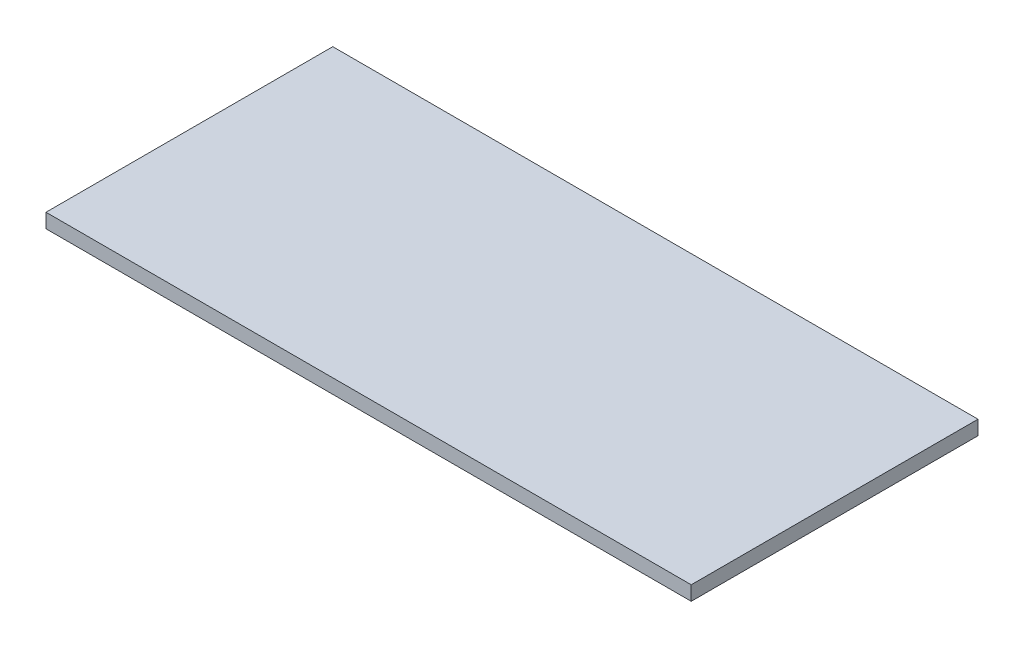
ISO-10303-21;
HEADER;
FILE_DESCRIPTION(('STEP AP214'),'2;1');
FILE_NAME('part.step','',(''),(''),'','','');
FILE_SCHEMA(('AUTOMOTIVE_DESIGN { 1 0 10303 214 1 1 1 1 }'));
ENDSEC;
DATA;
#1=APPLICATION_CONTEXT('core data for automotive mechanical design processes');
#2=APPLICATION_PROTOCOL_DEFINITION('international standard','automotive_design',2000,#1);
#3=PRODUCT_CONTEXT('',#1,'mechanical');
#4=PRODUCT('Part','Part','',(#3));
#5=PRODUCT_RELATED_PRODUCT_CATEGORY('part','',(#4));
#6=PRODUCT_DEFINITION_FORMATION('','',#4);
#7=PRODUCT_DEFINITION_CONTEXT('part definition',#1,'design');
#8=PRODUCT_DEFINITION('design','',#6,#7);
#9=PRODUCT_DEFINITION_SHAPE('','',#8);
#10=(LENGTH_UNIT() NAMED_UNIT(*) SI_UNIT(.MILLI.,.METRE.));
#11=(NAMED_UNIT(*) PLANE_ANGLE_UNIT() SI_UNIT($,.RADIAN.));
#12=(NAMED_UNIT(*) SI_UNIT($,.STERADIAN.) SOLID_ANGLE_UNIT());
#13=UNCERTAINTY_MEASURE_WITH_UNIT(LENGTH_MEASURE(1.E-05),#10,'distance_accuracy_value','');
#14=(GEOMETRIC_REPRESENTATION_CONTEXT(3) GLOBAL_UNCERTAINTY_ASSIGNED_CONTEXT((#13)) GLOBAL_UNIT_ASSIGNED_CONTEXT((#10,
#11,#12)) REPRESENTATION_CONTEXT('',''));
#15=CARTESIAN_POINT('',(0.,0.,0.));
#16=DIRECTION('',(0.,0.,1.));
#17=DIRECTION('',(1.,0.,0.));
#18=AXIS2_PLACEMENT_3D('',#15,#16,#17);
#19=CARTESIAN_POINT('',(450.,20.,-200.));
#20=DIRECTION('',(-1.,0.,0.));
#21=DIRECTION('',(0.,0.,1.));
#22=AXIS2_PLACEMENT_3D('',#19,#20,#21);
#23=PLANE('',#22);
#24=DIRECTION('',(0.,0.,-1.));
#25=VECTOR('',#24,1.);
#26=CARTESIAN_POINT('',(450.,0.,-200.));
#27=LINE('',#26,#25);
#28=CARTESIAN_POINT('',(450.,0.,200.));
#29=VERTEX_POINT('',#28);
#30=CARTESIAN_POINT('',(450.,0.,-200.));
#31=VERTEX_POINT('',#30);
#32=EDGE_CURVE('E96',#29,#31,#27,.T.);
#33=ORIENTED_EDGE('',*,*,#32,.T.);
#34=DIRECTION('',(0.,-1.,0.));
#35=VECTOR('',#34,1.);
#36=CARTESIAN_POINT('',(450.,20.,-200.));
#37=LINE('',#36,#35);
#38=CARTESIAN_POINT('',(450.,20.,-200.));
#39=VERTEX_POINT('',#38);
#40=EDGE_CURVE('E11',#39,#31,#37,.T.);
#41=ORIENTED_EDGE('',*,*,#40,.F.);
#42=DIRECTION('',(0.,0.,-1.));
#43=VECTOR('',#42,1.);
#44=CARTESIAN_POINT('',(450.,20.,-200.));
#45=LINE('',#44,#43);
#46=CARTESIAN_POINT('',(450.,20.,200.));
#47=VERTEX_POINT('',#46);
#48=EDGE_CURVE('E84',#47,#39,#45,.T.);
#49=ORIENTED_EDGE('',*,*,#48,.F.);
#50=DIRECTION('',(0.,-1.,0.));
#51=VECTOR('',#50,1.);
#52=CARTESIAN_POINT('',(450.,20.,200.));
#53=LINE('',#52,#51);
#54=EDGE_CURVE('E92',#47,#29,#53,.T.);
#55=ORIENTED_EDGE('',*,*,#54,.T.);
#56=EDGE_LOOP('',(#33,#41,#49,#55));
#57=FACE_BOUND('',#56,.T.);
#58=ADVANCED_FACE('F33',(#57),#23,.F.);
#59=CARTESIAN_POINT('',(-450.,20.,-200.));
#60=DIRECTION('',(0.,0.,1.));
#61=DIRECTION('',(1.,0.,0.));
#62=AXIS2_PLACEMENT_3D('',#59,#60,#61);
#63=PLANE('',#62);
#64=DIRECTION('',(-1.,0.,0.));
#65=VECTOR('',#64,1.);
#66=CARTESIAN_POINT('',(-450.,0.,-200.));
#67=LINE('',#66,#65);
#68=CARTESIAN_POINT('',(-450.,0.,-200.));
#69=VERTEX_POINT('',#68);
#70=EDGE_CURVE('E88',#31,#69,#67,.T.);
#71=ORIENTED_EDGE('',*,*,#70,.T.);
#72=DIRECTION('',(0.,-1.,0.));
#73=VECTOR('',#72,1.);
#74=CARTESIAN_POINT('',(-450.,20.,-200.));
#75=LINE('',#74,#73);
#76=CARTESIAN_POINT('',(-450.,20.,-200.));
#77=VERTEX_POINT('',#76);
#78=EDGE_CURVE('E41',#77,#69,#75,.T.);
#79=ORIENTED_EDGE('',*,*,#78,.F.);
#80=DIRECTION('',(-1.,0.,0.));
#81=VECTOR('',#80,1.);
#82=CARTESIAN_POINT('',(-450.,20.,-200.));
#83=LINE('',#82,#81);
#84=EDGE_CURVE('E79',#39,#77,#83,.T.);
#85=ORIENTED_EDGE('',*,*,#84,.F.);
#86=ORIENTED_EDGE('',*,*,#40,.T.);
#87=EDGE_LOOP('',(#71,#79,#85,#86));
#88=FACE_BOUND('',#87,.T.);
#89=ADVANCED_FACE('F87',(#88),#63,.F.);
#90=CARTESIAN_POINT('',(-450.,20.,-200.));
#91=DIRECTION('',(1.,0.,0.));
#92=DIRECTION('',(0.,0.,-1.));
#93=AXIS2_PLACEMENT_3D('',#90,#91,#92);
#94=PLANE('',#93);
#95=DIRECTION('',(0.,0.,1.));
#96=VECTOR('',#95,1.);
#97=CARTESIAN_POINT('',(-450.,0.,-200.));
#98=LINE('',#97,#96);
#99=CARTESIAN_POINT('',(-450.,0.,200.));
#100=VERTEX_POINT('',#99);
#101=EDGE_CURVE('E66',#69,#100,#98,.T.);
#102=ORIENTED_EDGE('',*,*,#101,.T.);
#103=DIRECTION('',(0.,-1.,0.));
#104=VECTOR('',#103,1.);
#105=CARTESIAN_POINT('',(-450.,20.,200.));
#106=LINE('',#105,#104);
#107=CARTESIAN_POINT('',(-450.,20.,200.));
#108=VERTEX_POINT('',#107);
#109=EDGE_CURVE('E89',#108,#100,#106,.T.);
#110=ORIENTED_EDGE('',*,*,#109,.F.);
#111=DIRECTION('',(0.,0.,1.));
#112=VECTOR('',#111,1.);
#113=CARTESIAN_POINT('',(-450.,20.,-200.));
#114=LINE('',#113,#112);
#115=EDGE_CURVE('E82',#77,#108,#114,.T.);
#116=ORIENTED_EDGE('',*,*,#115,.F.);
#117=ORIENTED_EDGE('',*,*,#78,.T.);
#118=EDGE_LOOP('',(#102,#110,#116,#117));
#119=FACE_BOUND('',#118,.T.);
#120=ADVANCED_FACE('F90',(#119),#94,.F.);
#121=CARTESIAN_POINT('',(-450.,20.,200.));
#122=DIRECTION('',(0.,0.,-1.));
#123=DIRECTION('',(-1.,0.,0.));
#124=AXIS2_PLACEMENT_3D('',#121,#122,#123);
#125=PLANE('',#124);
#126=DIRECTION('',(1.,0.,0.));
#127=VECTOR('',#126,1.);
#128=CARTESIAN_POINT('',(-450.,0.,200.));
#129=LINE('',#128,#127);
#130=EDGE_CURVE('E72',#100,#29,#129,.T.);
#131=ORIENTED_EDGE('',*,*,#130,.T.);
#132=ORIENTED_EDGE('',*,*,#54,.F.);
#133=DIRECTION('',(1.,0.,0.));
#134=VECTOR('',#133,1.);
#135=CARTESIAN_POINT('',(-450.,20.,200.));
#136=LINE('',#135,#134);
#137=EDGE_CURVE('E49',#108,#47,#136,.T.);
#138=ORIENTED_EDGE('',*,*,#137,.F.);
#139=ORIENTED_EDGE('',*,*,#109,.T.);
#140=EDGE_LOOP('',(#131,#132,#138,#139));
#141=FACE_BOUND('',#140,.T.);
#142=ADVANCED_FACE('F103',(#141),#125,.F.);
#143=CARTESIAN_POINT('',(0.,20.,0.));
#144=DIRECTION('',(0.,1.,0.));
#145=DIRECTION('',(0.,0.,1.));
#146=AXIS2_PLACEMENT_3D('',#143,#144,#145);
#147=PLANE('',#146);
#148=ORIENTED_EDGE('',*,*,#48,.T.);
#149=ORIENTED_EDGE('',*,*,#84,.T.);
#150=ORIENTED_EDGE('',*,*,#115,.T.);
#151=ORIENTED_EDGE('',*,*,#137,.T.);
#152=EDGE_LOOP('',(#148,#149,#150,#151));
#153=FACE_BOUND('',#152,.T.);
#154=ADVANCED_FACE('F80',(#153),#147,.T.);
#155=CARTESIAN_POINT('',(0.,0.,0.));
#156=DIRECTION('',(0.,1.,0.));
#157=DIRECTION('',(0.,0.,1.));
#158=AXIS2_PLACEMENT_3D('',#155,#156,#157);
#159=PLANE('',#158);
#160=ORIENTED_EDGE('',*,*,#32,.F.);
#161=ORIENTED_EDGE('',*,*,#130,.F.);
#162=ORIENTED_EDGE('',*,*,#101,.F.);
#163=ORIENTED_EDGE('',*,*,#70,.F.);
#164=EDGE_LOOP('',(#160,#161,#162,#163));
#165=FACE_BOUND('',#164,.T.);
#166=ADVANCED_FACE('F106',(#165),#159,.F.);
#167=CLOSED_SHELL('',(#58,#89,#120,#142,#154,#166));
#168=MANIFOLD_SOLID_BREP('B2',#167);
#169=ADVANCED_BREP_SHAPE_REPRESENTATION('',(#18,#168),#14);
#170=SHAPE_DEFINITION_REPRESENTATION(#9,#169);
ENDSEC;
END-ISO-10303-21;
